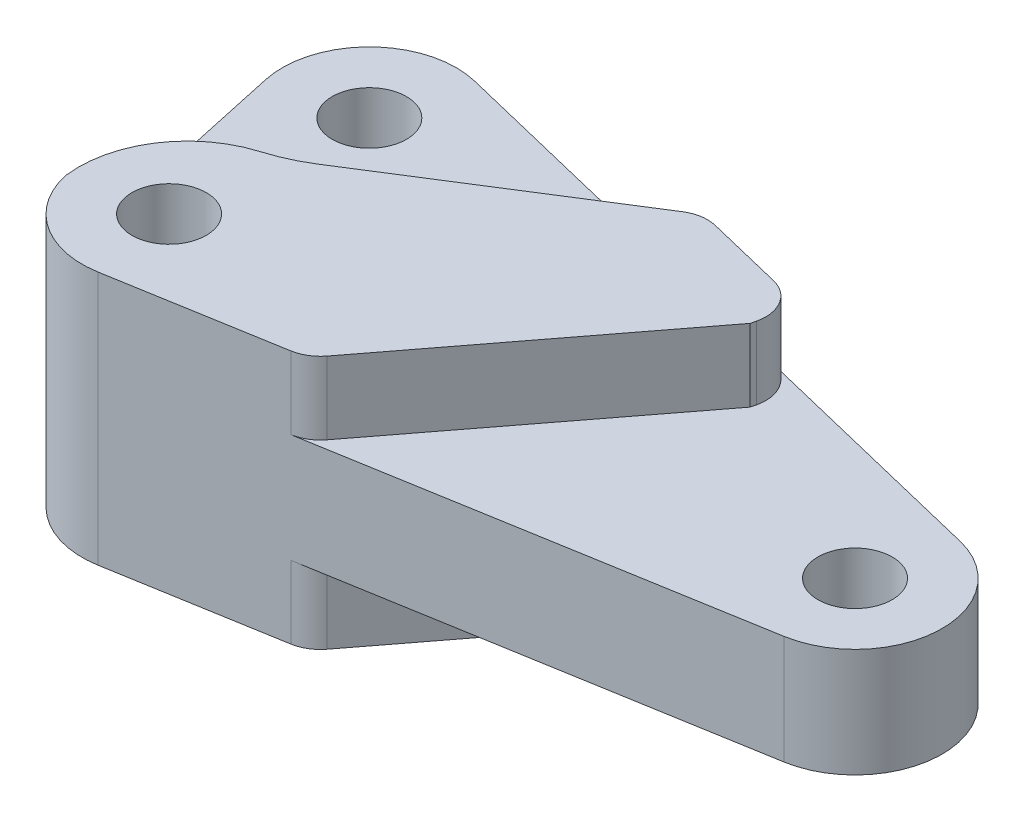
ISO-10303-21;
HEADER;
FILE_DESCRIPTION(('STEP AP214'),'2;1');
FILE_NAME('part.step','',(''),(''),'','','');
FILE_SCHEMA(('AUTOMOTIVE_DESIGN { 1 0 10303 214 1 1 1 1 }'));
ENDSEC;
DATA;
#1=APPLICATION_CONTEXT('core data for automotive mechanical design processes');
#2=APPLICATION_PROTOCOL_DEFINITION('international standard','automotive_design',2000,#1);
#3=PRODUCT_CONTEXT('',#1,'mechanical');
#4=PRODUCT('Part','Part','',(#3));
#5=PRODUCT_RELATED_PRODUCT_CATEGORY('part','',(#4));
#6=PRODUCT_DEFINITION_FORMATION('','',#4);
#7=PRODUCT_DEFINITION_CONTEXT('part definition',#1,'design');
#8=PRODUCT_DEFINITION('design','',#6,#7);
#9=PRODUCT_DEFINITION_SHAPE('','',#8);
#10=(LENGTH_UNIT() NAMED_UNIT(*) SI_UNIT(.MILLI.,.METRE.));
#11=(NAMED_UNIT(*) PLANE_ANGLE_UNIT() SI_UNIT($,.RADIAN.));
#12=(NAMED_UNIT(*) SI_UNIT($,.STERADIAN.) SOLID_ANGLE_UNIT());
#13=UNCERTAINTY_MEASURE_WITH_UNIT(LENGTH_MEASURE(1.E-05),#10,'distance_accuracy_value','');
#14=(GEOMETRIC_REPRESENTATION_CONTEXT(3) GLOBAL_UNCERTAINTY_ASSIGNED_CONTEXT((#13)) GLOBAL_UNIT_ASSIGNED_CONTEXT((#10,
#11,#12)) REPRESENTATION_CONTEXT('',''));
#15=CARTESIAN_POINT('',(0.,0.,0.));
#16=DIRECTION('',(0.,0.,1.));
#17=DIRECTION('',(1.,0.,0.));
#18=AXIS2_PLACEMENT_3D('',#15,#16,#17);
#19=CARTESIAN_POINT('',(2.05330457586919,8.89,12.0311396352858));
#20=DIRECTION('',(0.168233374939517,0.,0.985747194546584));
#21=DIRECTION('',(0.985747194546584,0.,-0.168233374939517));
#22=AXIS2_PLACEMENT_3D('',#19,#20,#21);
#23=PLANE('',#22);
#24=DIRECTION('',(-0.985747194546584,0.,0.168233374939517));
#25=VECTOR('',#24,1.);
#26=CARTESIAN_POINT('',(2.05330457586919,0.,12.0311396352858));
#27=LINE('',#26,#25);
#28=CARTESIAN_POINT('',(8.22636136478721,0.,10.9776097007972));
#29=VERTEX_POINT('',#28);
#30=CARTESIAN_POINT('',(2.45925132581501,0.,11.9618583914061));
#31=VERTEX_POINT('',#30);
#32=EDGE_CURVE('E449',#29,#31,#27,.T.);
#33=ORIENTED_EDGE('',*,*,#32,.F.);
#34=DIRECTION('',(0.,-1.,0.));
#35=VECTOR('',#34,1.);
#36=CARTESIAN_POINT('',(8.22636136478721,8.89,10.9776097007972));
#37=LINE('',#36,#35);
#38=CARTESIAN_POINT('',(8.22636136478721,2.54,10.9776097007972));
#39=VERTEX_POINT('',#38);
#40=EDGE_CURVE('E527',#29,#39,#37,.F.);
#41=ORIENTED_EDGE('',*,*,#40,.T.);
#42=DIRECTION('',(-0.985747194546584,0.,0.168233374939517));
#43=VECTOR('',#42,1.);
#44=CARTESIAN_POINT('',(2.05330457586919,2.54,12.0311396352858));
#45=LINE('',#44,#43);
#46=CARTESIAN_POINT('',(22.9735583569255,2.54,8.46076690924709));
#47=VERTEX_POINT('',#46);
#48=EDGE_CURVE('E303',#47,#39,#45,.T.);
#49=ORIENTED_EDGE('',*,*,#48,.F.);
#50=DIRECTION('',(0.,-1.,0.));
#51=VECTOR('',#50,1.);
#52=CARTESIAN_POINT('',(22.9735583569255,6.35,8.46076690924709));
#53=LINE('',#52,#51);
#54=CARTESIAN_POINT('',(22.9735583569255,6.35,8.46076690924709));
#55=VERTEX_POINT('',#54);
#56=EDGE_CURVE('E409',#55,#47,#53,.T.);
#57=ORIENTED_EDGE('',*,*,#56,.F.);
#58=DIRECTION('',(-0.985747194546584,0.,0.168233374939517));
#59=VECTOR('',#58,1.);
#60=CARTESIAN_POINT('',(2.05330457586919,6.35,12.0311396352858));
#61=LINE('',#60,#59);
#62=CARTESIAN_POINT('',(8.22636136478721,6.35,10.9776097007972));
#63=VERTEX_POINT('',#62);
#64=EDGE_CURVE('E385',#55,#63,#61,.T.);
#65=ORIENTED_EDGE('',*,*,#64,.T.);
#66=DIRECTION('',(0.,-1.,0.));
#67=VECTOR('',#66,1.);
#68=CARTESIAN_POINT('',(8.22636136478721,8.89,10.9776097007972));
#69=LINE('',#68,#67);
#70=CARTESIAN_POINT('',(8.22636136478721,8.89,10.9776097007972));
#71=VERTEX_POINT('',#70);
#72=EDGE_CURVE('E524',#63,#71,#69,.F.);
#73=ORIENTED_EDGE('',*,*,#72,.T.);
#74=DIRECTION('',(-0.985747194546584,0.,0.168233374939517));
#75=VECTOR('',#74,1.);
#76=CARTESIAN_POINT('',(2.05330457586919,8.89,12.0311396352858));
#77=LINE('',#76,#75);
#78=CARTESIAN_POINT('',(2.45925132581501,8.89,11.9618583914061));
#79=VERTEX_POINT('',#78);
#80=EDGE_CURVE('E422',#71,#79,#77,.T.);
#81=ORIENTED_EDGE('',*,*,#80,.T.);
#82=DIRECTION('',(0.,-1.,0.));
#83=VECTOR('',#82,1.);
#84=CARTESIAN_POINT('',(2.45925132581501,8.89,11.9618583914061));
#85=LINE('',#84,#83);
#86=EDGE_CURVE('E463',#79,#31,#85,.T.);
#87=ORIENTED_EDGE('',*,*,#86,.T.);
#88=EDGE_LOOP('',(#33,#41,#49,#57,#65,#73,#81,#87));
#89=FACE_BOUND('',#88,.T.);
#90=ADVANCED_FACE('F113',(#89),#23,.T.);
#91=CARTESIAN_POINT('',(0.719500148606915,8.89,-2.96186149847602));
#92=DIRECTION('',(0.236056479201744,0.,-0.971739336770348));
#93=DIRECTION('',(-0.971739336770349,0.,-0.236056479201744));
#94=AXIS2_PLACEMENT_3D('',#91,#92,#93);
#95=PLANE('',#94);
#96=DIRECTION('',(0.971739336770349,0.,0.236056479201744));
#97=VECTOR('',#96,1.);
#98=CARTESIAN_POINT('',(0.719500148606915,0.,-2.96186149847602));
#99=LINE('',#98,#97);
#100=CARTESIAN_POINT('',(11.8425674851343,0.,-0.259828130030529));
#101=VERTEX_POINT('',#100);
#102=CARTESIAN_POINT('',(14.5415204748284,0.,0.395805861689579));
#103=VERTEX_POINT('',#102);
#104=EDGE_CURVE('E452',#101,#103,#99,.T.);
#105=ORIENTED_EDGE('',*,*,#104,.F.);
#106=DIRECTION('',(0.,-1.,0.));
#107=VECTOR('',#106,1.);
#108=CARTESIAN_POINT('',(11.8425674851343,8.89,-0.259828130030531));
#109=LINE('',#108,#107);
#110=CARTESIAN_POINT('',(11.8425674851343,2.54,-0.259828130030529));
#111=VERTEX_POINT('',#110);
#112=EDGE_CURVE('E504',#101,#111,#109,.F.);
#113=ORIENTED_EDGE('',*,*,#112,.T.);
#114=DIRECTION('',(0.971739336770349,0.,0.236056479201744));
#115=VECTOR('',#114,1.);
#116=CARTESIAN_POINT('',(0.719500148606915,2.54,-2.96186149847602));
#117=LINE('',#116,#115);
#118=CARTESIAN_POINT('',(0.719500148606915,2.54,-2.96186149847602));
#119=VERTEX_POINT('',#118);
#120=EDGE_CURVE('E331',#119,#111,#117,.T.);
#121=ORIENTED_EDGE('',*,*,#120,.F.);
#122=DIRECTION('',(0.,-1.,0.));
#123=VECTOR('',#122,1.);
#124=CARTESIAN_POINT('',(0.719500148606915,6.35,-2.96186149847602));
#125=LINE('',#124,#123);
#126=CARTESIAN_POINT('',(0.719500148606915,6.35,-2.96186149847602));
#127=VERTEX_POINT('',#126);
#128=EDGE_CURVE('E377',#127,#119,#125,.T.);
#129=ORIENTED_EDGE('',*,*,#128,.F.);
#130=DIRECTION('',(0.971739336770349,0.,0.236056479201744));
#131=VECTOR('',#130,1.);
#132=CARTESIAN_POINT('',(0.719500148606915,6.35,-2.96186149847602));
#133=LINE('',#132,#131);
#134=CARTESIAN_POINT('',(11.8425674851343,6.35,-0.25982813003053));
#135=VERTEX_POINT('',#134);
#136=EDGE_CURVE('E363',#127,#135,#133,.T.);
#137=ORIENTED_EDGE('',*,*,#136,.T.);
#138=DIRECTION('',(0.,-1.,0.));
#139=VECTOR('',#138,1.);
#140=CARTESIAN_POINT('',(11.8425674851343,8.89,-0.259828130030531));
#141=LINE('',#140,#139);
#142=CARTESIAN_POINT('',(11.8425674851343,8.89,-0.259828130030529));
#143=VERTEX_POINT('',#142);
#144=EDGE_CURVE('E501',#135,#143,#141,.F.);
#145=ORIENTED_EDGE('',*,*,#144,.T.);
#146=DIRECTION('',(0.971739336770349,0.,0.236056479201744));
#147=VECTOR('',#146,1.);
#148=CARTESIAN_POINT('',(0.719500148606915,8.89,-2.96186149847602));
#149=LINE('',#148,#147);
#150=CARTESIAN_POINT('',(14.5415204748284,8.89,0.395805861689579));
#151=VERTEX_POINT('',#150);
#152=EDGE_CURVE('E433',#143,#151,#149,.T.);
#153=ORIENTED_EDGE('',*,*,#152,.T.);
#154=DIRECTION('',(0.,-1.,0.));
#155=VECTOR('',#154,1.);
#156=CARTESIAN_POINT('',(14.5415204748284,6.35,0.395805861689578));
#157=LINE('',#156,#155);
#158=CARTESIAN_POINT('',(14.5415204748284,6.35,0.395805861689579));
#159=VERTEX_POINT('',#158);
#160=EDGE_CURVE('E497',#151,#159,#157,.T.);
#161=ORIENTED_EDGE('',*,*,#160,.T.);
#162=DIRECTION('',(0.971739336770349,0.,0.236056479201744));
#163=VECTOR('',#162,1.);
#164=CARTESIAN_POINT('',(0.719500148606915,6.35,-2.96186149847602));
#165=LINE('',#164,#163);
#166=CARTESIAN_POINT('',(23.1802831787168,6.35,2.49434796179308));
#167=VERTEX_POINT('',#166);
#168=EDGE_CURVE('E392',#159,#167,#165,.T.);
#169=ORIENTED_EDGE('',*,*,#168,.T.);
#170=DIRECTION('',(0.,-1.,0.));
#171=VECTOR('',#170,1.);
#172=CARTESIAN_POINT('',(23.1802831787168,6.35,2.49434796179308));
#173=LINE('',#172,#171);
#174=CARTESIAN_POINT('',(23.1802831787168,2.54,2.49434796179308));
#175=VERTEX_POINT('',#174);
#176=EDGE_CURVE('E405',#167,#175,#173,.T.);
#177=ORIENTED_EDGE('',*,*,#176,.T.);
#178=DIRECTION('',(0.971739336770349,0.,0.236056479201744));
#179=VECTOR('',#178,1.);
#180=CARTESIAN_POINT('',(0.719500148606915,2.54,-2.96186149847602));
#181=LINE('',#180,#179);
#182=CARTESIAN_POINT('',(14.5415204748284,2.54,0.395805861689579));
#183=VERTEX_POINT('',#182);
#184=EDGE_CURVE('E294',#183,#175,#181,.T.);
#185=ORIENTED_EDGE('',*,*,#184,.F.);
#186=DIRECTION('',(0.,-1.,0.));
#187=VECTOR('',#186,1.);
#188=CARTESIAN_POINT('',(14.5415204748284,0.,0.395805861689578));
#189=LINE('',#188,#187);
#190=EDGE_CURVE('E493',#183,#103,#189,.T.);
#191=ORIENTED_EDGE('',*,*,#190,.T.);
#192=EDGE_LOOP('',(#105,#113,#121,#129,#137,#145,#153,#161,#169,#177,#185,#191));
#193=FACE_BOUND('',#192,.T.);
#194=ADVANCED_FACE('F636',(#193),#95,.T.);
#195=CARTESIAN_POINT('',(0.,0.,0.));
#196=DIRECTION('',(0.,1.,0.));
#197=DIRECTION('',(0.,0.,1.));
#198=AXIS2_PLACEMENT_3D('',#195,#196,#197);
#199=PLANE('',#198);
#200=CARTESIAN_POINT('',(1.94647599899937,0.,8.95730094242811));
#201=DIRECTION('',(0.,1.,0.));
#202=DIRECTION('',(0.,0.,1.));
#203=AXIS2_PLACEMENT_3D('',#200,#201,#202);
#204=CIRCLE('',#203,1.2999974);
#205=CARTESIAN_POINT('',(1.94647599899937,0.,10.2572983424281));
#206=VERTEX_POINT('',#205);
#207=EDGE_CURVE('E418',#206,#206,#204,.T.);
#208=ORIENTED_EDGE('',*,*,#207,.T.);
#209=EDGE_LOOP('',(#208));
#210=FACE_BOUND('',#209,.T.);
#211=DIRECTION('',(0.845633638943895,0.,-0.533763757374465));
#212=VECTOR('',#211,1.);
#213=CARTESIAN_POINT('',(3.05045987339507,0.,4.83279624656436));
#214=LINE('',#213,#212);
#215=CARTESIAN_POINT('',(3.05045987339507,0.,4.83279624656436));
#216=VERTEX_POINT('',#215);
#217=CARTESIAN_POINT('',(10.8648957846825,0.,-0.0996738937909351));
#218=VERTEX_POINT('',#217);
#219=EDGE_CURVE('E327',#216,#218,#214,.T.);
#220=ORIENTED_EDGE('',*,*,#219,.T.);
#221=CARTESIAN_POINT('',(11.5427757565481,0.,0.974280827667812));
#222=DIRECTION('',(0.,1.,0.));
#223=DIRECTION('',(0.,0.,1.));
#224=AXIS2_PLACEMENT_3D('',#221,#222,#223);
#225=CIRCLE('',#224,1.27);
#226=EDGE_CURVE('E490',#218,#101,#225,.F.);
#227=ORIENTED_EDGE('',*,*,#226,.T.);
#228=ORIENTED_EDGE('',*,*,#104,.T.);
#229=CARTESIAN_POINT('',(14.2417287462421,0.,1.62991481938792));
#230=DIRECTION('',(0.,1.,0.));
#231=DIRECTION('',(0.,0.,1.));
#232=AXIS2_PLACEMENT_3D('',#229,#230,#231);
#233=CIRCLE('',#232,1.27);
#234=CARTESIAN_POINT('',(15.4758377039405,0.,1.92970654797413));
#235=VERTEX_POINT('',#234);
#236=EDGE_CURVE('E484',#103,#235,#233,.F.);
#237=ORIENTED_EDGE('',*,*,#236,.T.);
#238=DIRECTION('',(0.236056479201743,0.,-0.971739336770349));
#239=VECTOR('',#238,1.);
#240=CARTESIAN_POINT('',(15.0561292839198,0.,3.65745908875181));
#241=LINE('',#240,#239);
#242=CARTESIAN_POINT('',(15.4338828000476,0.,2.10241619195867));
#243=VERTEX_POINT('',#242);
#244=EDGE_CURVE('E309',#243,#235,#241,.T.);
#245=ORIENTED_EDGE('',*,*,#244,.F.);
#246=DIRECTION('',(-0.607021351259015,0.,0.794685522150542));
#247=VECTOR('',#246,1.);
#248=CARTESIAN_POINT('',(10.7610708727211,0.,8.21985502450838));
#249=LINE('',#248,#247);
#250=CARTESIAN_POINT('',(9.02195559174521,0.,10.496627879822));
#251=VERTEX_POINT('',#250);
#252=EDGE_CURVE('E290',#243,#251,#249,.T.);
#253=ORIENTED_EDGE('',*,*,#252,.T.);
#254=CARTESIAN_POINT('',(8.01270497861402,0.,9.72571076372304));
#255=DIRECTION('',(0.,1.,0.));
#256=DIRECTION('',(0.,0.,1.));
#257=AXIS2_PLACEMENT_3D('',#254,#255,#256);
#258=CIRCLE('',#257,1.27);
#259=EDGE_CURVE('E487',#251,#29,#258,.F.);
#260=ORIENTED_EDGE('',*,*,#259,.T.);
#261=ORIENTED_EDGE('',*,*,#32,.T.);
#262=CARTESIAN_POINT('',(1.94647599899937,0.,8.95730094242811));
#263=DIRECTION('',(0.,1.,0.));
#264=DIRECTION('',(0.,0.,1.));
#265=AXIS2_PLACEMENT_3D('',#262,#263,#264);
#266=CIRCLE('',#265,3.048);
#267=CARTESIAN_POINT('',(-1.03201023767591,0.,9.60454412542501));
#268=VERTEX_POINT('',#267);
#269=EDGE_CURVE('E413',#268,#31,#266,.T.);
#270=ORIENTED_EDGE('',*,*,#269,.F.);
#271=CARTESIAN_POINT('',(2.74708607229645,0.,9.12026003529476));
#272=DIRECTION('',(0.,1.,0.));
#273=DIRECTION('',(0.,0.,1.));
#274=AXIS2_PLACEMENT_3D('',#271,#272,#273);
#275=CIRCLE('',#274,3.81);
#276=CARTESIAN_POINT('',(1.64825164337787,0.,5.47215602117686));
#277=VERTEX_POINT('',#276);
#278=EDGE_CURVE('E472',#268,#277,#275,.F.);
#279=ORIENTED_EDGE('',*,*,#278,.T.);
#280=CARTESIAN_POINT('',(0.,0.,0.));
#281=DIRECTION('',(0.,1.,0.));
#282=DIRECTION('',(0.,0.,1.));
#283=AXIS2_PLACEMENT_3D('',#280,#281,#282);
#284=CIRCLE('',#283,5.715);
#285=EDGE_CURVE('E293',#277,#216,#284,.T.);
#286=ORIENTED_EDGE('',*,*,#285,.T.);
#287=EDGE_LOOP('',(#220,#227,#228,#237,#245,#253,#260,#261,#270,#279,#286));
#288=FACE_BOUND('',#287,.T.);
#289=ADVANCED_FACE('F658',(#210,#288),#199,.F.);
#290=CARTESIAN_POINT('',(0.,8.89,0.));
#291=DIRECTION('',(0.,-1.,0.));
#292=DIRECTION('',(0.,0.,-1.));
#293=AXIS2_PLACEMENT_3D('',#290,#291,#292);
#294=CYLINDRICAL_SURFACE('',#293,5.715);
#295=CARTESIAN_POINT('',(0.,6.35,0.));
#296=DIRECTION('',(0.,1.,0.));
#297=DIRECTION('',(0.,0.,1.));
#298=AXIS2_PLACEMENT_3D('',#295,#296,#297);
#299=CIRCLE('',#298,5.715);
#300=CARTESIAN_POINT('',(1.64825164337787,6.35,5.47215602117686));
#301=VERTEX_POINT('',#300);
#302=CARTESIAN_POINT('',(3.05045987339507,6.35,4.83279624656436));
#303=VERTEX_POINT('',#302);
#304=EDGE_CURVE('E355',#301,#303,#299,.T.);
#305=ORIENTED_EDGE('',*,*,#304,.F.);
#306=DIRECTION('',(0.,-1.,0.));
#307=VECTOR('',#306,1.);
#308=CARTESIAN_POINT('',(1.64825164337787,8.89,5.47215602117686));
#309=LINE('',#308,#307);
#310=CARTESIAN_POINT('',(1.64825164337787,8.89,5.47215602117686));
#311=VERTEX_POINT('',#310);
#312=EDGE_CURVE('E564',#301,#311,#309,.F.);
#313=ORIENTED_EDGE('',*,*,#312,.T.);
#314=CARTESIAN_POINT('',(0.,8.89,0.));
#315=DIRECTION('',(0.,1.,0.));
#316=DIRECTION('',(0.,0.,1.));
#317=AXIS2_PLACEMENT_3D('',#314,#315,#316);
#318=CIRCLE('',#317,5.715);
#319=CARTESIAN_POINT('',(3.05045987339507,8.89,4.83279624656436));
#320=VERTEX_POINT('',#319);
#321=EDGE_CURVE('E414',#311,#320,#318,.T.);
#322=ORIENTED_EDGE('',*,*,#321,.T.);
#323=DIRECTION('',(0.,-1.,0.));
#324=VECTOR('',#323,1.);
#325=CARTESIAN_POINT('',(3.05045987339507,8.89,4.83279624656436));
#326=LINE('',#325,#324);
#327=EDGE_CURVE('E445',#320,#303,#326,.T.);
#328=ORIENTED_EDGE('',*,*,#327,.T.);
#329=EDGE_LOOP('',(#305,#313,#322,#328));
#330=FACE_BOUND('',#329,.T.);
#331=ADVANCED_FACE('F625',(#330),#294,.F.);
#332=CARTESIAN_POINT('',(-2.97848623667528,8.89,0.647243182996907));
#333=DIRECTION('',(0.977193647203174,0.,-0.212350125655153));
#334=DIRECTION('',(-0.212350125655153,0.,-0.977193647203174));
#335=AXIS2_PLACEMENT_3D('',#332,#333,#334);
#336=PLANE('',#335);
#337=DIRECTION('',(0.212350125655153,0.,0.977193647203174));
#338=VECTOR('',#337,1.);
#339=CARTESIAN_POINT('',(-2.97848623667528,2.54,0.647243182996907));
#340=LINE('',#339,#338);
#341=CARTESIAN_POINT('',(-2.97848623667528,2.54,0.647243182996907));
#342=VERTEX_POINT('',#341);
#343=CARTESIAN_POINT('',(-1.03201023767591,2.54,9.60454412542501));
#344=VERTEX_POINT('',#343);
#345=EDGE_CURVE('E338',#342,#344,#340,.T.);
#346=ORIENTED_EDGE('',*,*,#345,.T.);
#347=DIRECTION('',(0.,-1.,0.));
#348=VECTOR('',#347,1.);
#349=CARTESIAN_POINT('',(-1.03201023767591,8.89,9.60454412542501));
#350=LINE('',#349,#348);
#351=CARTESIAN_POINT('',(-1.03201023767591,6.35,9.60454412542501));
#352=VERTEX_POINT('',#351);
#353=EDGE_CURVE('E473',#352,#344,#350,.T.);
#354=ORIENTED_EDGE('',*,*,#353,.F.);
#355=DIRECTION('',(0.212350125655153,0.,0.977193647203174));
#356=VECTOR('',#355,1.);
#357=CARTESIAN_POINT('',(-2.97848623667528,6.35,0.647243182996907));
#358=LINE('',#357,#356);
#359=CARTESIAN_POINT('',(-2.97848623667528,6.35,0.647243182996907));
#360=VERTEX_POINT('',#359);
#361=EDGE_CURVE('E370',#360,#352,#358,.T.);
#362=ORIENTED_EDGE('',*,*,#361,.F.);
#363=DIRECTION('',(0.,-1.,0.));
#364=VECTOR('',#363,1.);
#365=CARTESIAN_POINT('',(-2.97848623667528,6.35,0.647243182996907));
#366=LINE('',#365,#364);
#367=EDGE_CURVE('E373',#360,#342,#366,.T.);
#368=ORIENTED_EDGE('',*,*,#367,.T.);
#369=EDGE_LOOP('',(#346,#354,#362,#368));
#370=FACE_BOUND('',#369,.T.);
#371=ADVANCED_FACE('F609',(#370),#336,.F.);
#372=CARTESIAN_POINT('',(1.94647599899937,8.89,8.95730094242811));
#373=DIRECTION('',(0.,-1.,0.));
#374=DIRECTION('',(0.,0.,-1.));
#375=AXIS2_PLACEMENT_3D('',#372,#373,#374);
#376=CYLINDRICAL_SURFACE('',#375,3.048);
#377=ORIENTED_EDGE('',*,*,#269,.T.);
#378=ORIENTED_EDGE('',*,*,#86,.F.);
#379=CARTESIAN_POINT('',(1.94647599899937,8.89,8.95730094242811));
#380=DIRECTION('',(0.,1.,0.));
#381=DIRECTION('',(0.,0.,1.));
#382=AXIS2_PLACEMENT_3D('',#379,#380,#381);
#383=CIRCLE('',#382,3.048);
#384=CARTESIAN_POINT('',(-1.03201023767591,8.89,9.60454412542501));
#385=VERTEX_POINT('',#384);
#386=EDGE_CURVE('E417',#385,#79,#383,.T.);
#387=ORIENTED_EDGE('',*,*,#386,.F.);
#388=EDGE_CURVE('E468',#385,#352,#350,.T.);
#389=ORIENTED_EDGE('',*,*,#388,.T.);
#390=ORIENTED_EDGE('',*,*,#353,.T.);
#391=EDGE_CURVE('E467',#344,#268,#350,.T.);
#392=ORIENTED_EDGE('',*,*,#391,.T.);
#393=EDGE_LOOP('',(#377,#378,#387,#389,#390,#392));
#394=FACE_BOUND('',#393,.T.);
#395=ADVANCED_FACE('F613',(#394),#376,.T.);
#396=CARTESIAN_POINT('',(10.7610708727211,8.89,8.21985502450838));
#397=DIRECTION('',(0.794685522150542,0.,0.607021351259015));
#398=DIRECTION('',(0.607021351259015,0.,-0.794685522150542));
#399=AXIS2_PLACEMENT_3D('',#396,#397,#398);
#400=PLANE('',#399);
#401=DIRECTION('',(-0.607021351259015,0.,0.794685522150542));
#402=VECTOR('',#401,1.);
#403=CARTESIAN_POINT('',(10.7610708727211,8.89,8.21985502450838));
#404=LINE('',#403,#402);
#405=CARTESIAN_POINT('',(15.4338828000476,8.89,2.10241619195867));
#406=VERTEX_POINT('',#405);
#407=CARTESIAN_POINT('',(9.02195559174521,8.89,10.496627879822));
#408=VERTEX_POINT('',#407);
#409=EDGE_CURVE('E425',#406,#408,#404,.T.);
#410=ORIENTED_EDGE('',*,*,#409,.T.);
#411=DIRECTION('',(0.,-1.,0.));
#412=VECTOR('',#411,1.);
#413=CARTESIAN_POINT('',(9.02195559174521,8.89,10.496627879822));
#414=LINE('',#413,#412);
#415=CARTESIAN_POINT('',(9.02195559174521,6.35,10.496627879822));
#416=VERTEX_POINT('',#415);
#417=EDGE_CURVE('E531',#408,#416,#414,.T.);
#418=ORIENTED_EDGE('',*,*,#417,.T.);
#419=DIRECTION('',(-0.607021351259015,0.,0.794685522150542));
#420=VECTOR('',#419,1.);
#421=CARTESIAN_POINT('',(10.7610708727211,6.35,8.21985502450838));
#422=LINE('',#421,#420);
#423=CARTESIAN_POINT('',(15.4338828000476,6.35,2.10241619195867));
#424=VERTEX_POINT('',#423);
#425=EDGE_CURVE('E381',#424,#416,#422,.T.);
#426=ORIENTED_EDGE('',*,*,#425,.F.);
#427=DIRECTION('',(0.,-1.,0.));
#428=VECTOR('',#427,1.);
#429=CARTESIAN_POINT('',(15.4338828000476,8.89,2.10241619195867));
#430=LINE('',#429,#428);
#431=EDGE_CURVE('E459',#406,#424,#430,.T.);
#432=ORIENTED_EDGE('',*,*,#431,.F.);
#433=EDGE_LOOP('',(#410,#418,#426,#432));
#434=FACE_BOUND('',#433,.T.);
#435=ADVANCED_FACE('F692',(#434),#400,.T.);
#436=CARTESIAN_POINT('',(15.0561292839198,8.89,3.65745908875181));
#437=DIRECTION('',(-0.971739336770349,0.,-0.236056479201743));
#438=DIRECTION('',(-0.236056479201743,0.,0.971739336770349));
#439=AXIS2_PLACEMENT_3D('',#436,#437,#438);
#440=PLANE('',#439);
#441=DIRECTION('',(0.236056479201743,0.,-0.971739336770349));
#442=VECTOR('',#441,1.);
#443=CARTESIAN_POINT('',(15.0561292839198,6.35,3.65745908875181));
#444=LINE('',#443,#442);
#445=CARTESIAN_POINT('',(15.4758377039405,6.35,1.92970654797413));
#446=VERTEX_POINT('',#445);
#447=EDGE_CURVE('E396',#424,#446,#444,.T.);
#448=ORIENTED_EDGE('',*,*,#447,.T.);
#449=DIRECTION('',(0.,-1.,0.));
#450=VECTOR('',#449,1.);
#451=CARTESIAN_POINT('',(15.4758377039405,8.89,1.92970654797413));
#452=LINE('',#451,#450);
#453=CARTESIAN_POINT('',(15.4758377039405,8.89,1.92970654797413));
#454=VERTEX_POINT('',#453);
#455=EDGE_CURVE('E535',#446,#454,#452,.F.);
#456=ORIENTED_EDGE('',*,*,#455,.T.);
#457=DIRECTION('',(0.236056479201743,0.,-0.971739336770349));
#458=VECTOR('',#457,1.);
#459=CARTESIAN_POINT('',(15.0561292839198,8.89,3.65745908875181));
#460=LINE('',#459,#458);
#461=EDGE_CURVE('E429',#406,#454,#460,.T.);
#462=ORIENTED_EDGE('',*,*,#461,.F.);
#463=ORIENTED_EDGE('',*,*,#431,.T.);
#464=EDGE_LOOP('',(#448,#456,#462,#463));
#465=FACE_BOUND('',#464,.T.);
#466=ADVANCED_FACE('F832',(#465),#440,.F.);
#467=CARTESIAN_POINT('',(3.05045987339507,8.89,4.83279624656436));
#468=DIRECTION('',(-0.533763757374465,0.,-0.845633638943895));
#469=DIRECTION('',(-0.845633638943895,0.,0.533763757374465));
#470=AXIS2_PLACEMENT_3D('',#467,#468,#469);
#471=PLANE('',#470);
#472=DIRECTION('',(0.845633638943895,0.,-0.533763757374465));
#473=VECTOR('',#472,1.);
#474=CARTESIAN_POINT('',(3.05045987339507,8.89,4.83279624656436));
#475=LINE('',#474,#473);
#476=CARTESIAN_POINT('',(10.8648957846825,8.89,-0.0996738937909351));
#477=VERTEX_POINT('',#476);
#478=EDGE_CURVE('E437',#320,#477,#475,.T.);
#479=ORIENTED_EDGE('',*,*,#478,.T.);
#480=DIRECTION('',(0.,-1.,0.));
#481=VECTOR('',#480,1.);
#482=CARTESIAN_POINT('',(10.8648957846825,8.89,-0.0996738937909351));
#483=LINE('',#482,#481);
#484=CARTESIAN_POINT('',(10.8648957846825,6.35,-0.0996738937909351));
#485=VERTEX_POINT('',#484);
#486=EDGE_CURVE('E508',#477,#485,#483,.T.);
#487=ORIENTED_EDGE('',*,*,#486,.T.);
#488=DIRECTION('',(0.845633638943895,0.,-0.533763757374465));
#489=VECTOR('',#488,1.);
#490=CARTESIAN_POINT('',(3.05045987339507,6.35,4.83279624656436));
#491=LINE('',#490,#489);
#492=EDGE_CURVE('E359',#303,#485,#491,.T.);
#493=ORIENTED_EDGE('',*,*,#492,.F.);
#494=ORIENTED_EDGE('',*,*,#327,.F.);
#495=EDGE_LOOP('',(#479,#487,#493,#494));
#496=FACE_BOUND('',#495,.T.);
#497=ADVANCED_FACE('F628',(#496),#471,.T.);
#498=CARTESIAN_POINT('',(1.94647599899937,8.89,8.95730094242811));
#499=DIRECTION('',(0.,-1.,0.));
#500=DIRECTION('',(0.,0.,-1.));
#501=AXIS2_PLACEMENT_3D('',#498,#499,#500);
#502=CYLINDRICAL_SURFACE('',#501,1.2999974);
#503=CARTESIAN_POINT('',(1.94647599899937,8.89,8.95730094242811));
#504=DIRECTION('',(0.,1.,0.));
#505=DIRECTION('',(0.,0.,1.));
#506=AXIS2_PLACEMENT_3D('',#503,#504,#505);
#507=CIRCLE('',#506,1.2999974);
#508=CARTESIAN_POINT('',(1.94647599899937,8.89,10.2572983424281));
#509=VERTEX_POINT('',#508);
#510=EDGE_CURVE('E441',#509,#509,#507,.T.);
#511=ORIENTED_EDGE('',*,*,#510,.T.);
#512=EDGE_LOOP('',(#511));
#513=FACE_BOUND('',#512,.T.);
#514=ORIENTED_EDGE('',*,*,#207,.F.);
#515=EDGE_LOOP('',(#514));
#516=FACE_BOUND('',#515,.T.);
#517=ADVANCED_FACE('F823',(#513,#516),#502,.F.);
#518=CARTESIAN_POINT('',(0.,8.89,0.));
#519=DIRECTION('',(0.,1.,0.));
#520=DIRECTION('',(0.,0.,1.));
#521=AXIS2_PLACEMENT_3D('',#518,#519,#520);
#522=PLANE('',#521);
#523=ORIENTED_EDGE('',*,*,#152,.F.);
#524=CARTESIAN_POINT('',(11.5427757565481,8.89,0.974280827667811));
#525=DIRECTION('',(0.,1.,0.));
#526=DIRECTION('',(0.,0.,1.));
#527=AXIS2_PLACEMENT_3D('',#524,#525,#526);
#528=CIRCLE('',#527,1.27);
#529=EDGE_CURVE('E518',#143,#477,#528,.T.);
#530=ORIENTED_EDGE('',*,*,#529,.T.);
#531=ORIENTED_EDGE('',*,*,#478,.F.);
#532=ORIENTED_EDGE('',*,*,#321,.F.);
#533=CARTESIAN_POINT('',(2.74708607229645,8.89,9.12026003529476));
#534=DIRECTION('',(0.,1.,0.));
#535=DIRECTION('',(0.,0.,1.));
#536=AXIS2_PLACEMENT_3D('',#533,#534,#535);
#537=CIRCLE('',#536,3.81);
#538=EDGE_CURVE('E561',#311,#385,#537,.T.);
#539=ORIENTED_EDGE('',*,*,#538,.T.);
#540=ORIENTED_EDGE('',*,*,#386,.T.);
#541=ORIENTED_EDGE('',*,*,#80,.F.);
#542=CARTESIAN_POINT('',(8.01270497861402,8.89,9.72571076372304));
#543=DIRECTION('',(0.,1.,0.));
#544=DIRECTION('',(0.,0.,1.));
#545=AXIS2_PLACEMENT_3D('',#542,#543,#544);
#546=CIRCLE('',#545,1.27);
#547=EDGE_CURVE('E515',#71,#408,#546,.T.);
#548=ORIENTED_EDGE('',*,*,#547,.T.);
#549=ORIENTED_EDGE('',*,*,#409,.F.);
#550=ORIENTED_EDGE('',*,*,#461,.T.);
#551=CARTESIAN_POINT('',(14.2417287462421,8.89,1.62991481938792));
#552=DIRECTION('',(0.,1.,0.));
#553=DIRECTION('',(0.,0.,1.));
#554=AXIS2_PLACEMENT_3D('',#551,#552,#553);
#555=CIRCLE('',#554,1.27);
#556=EDGE_CURVE('E512',#454,#151,#555,.T.);
#557=ORIENTED_EDGE('',*,*,#556,.T.);
#558=EDGE_LOOP('',(#523,#530,#531,#532,#539,#540,#541,#548,#549,#550,#557));
#559=FACE_BOUND('',#558,.T.);
#560=ORIENTED_EDGE('',*,*,#510,.F.);
#561=EDGE_LOOP('',(#560));
#562=FACE_BOUND('',#561,.T.);
#563=ADVANCED_FACE('F618',(#559,#562),#522,.T.);
#564=CARTESIAN_POINT('',(22.4607830301098,6.35,5.4562094602691));
#565=DIRECTION('',(0.,-1.,0.));
#566=DIRECTION('',(0.,0.,-1.));
#567=AXIS2_PLACEMENT_3D('',#564,#565,#566);
#568=CYLINDRICAL_SURFACE('',#567,3.048);
#569=CARTESIAN_POINT('',(22.4607830301098,2.54,5.4562094602691));
#570=DIRECTION('',(0.,1.,0.));
#571=DIRECTION('',(0.,0.,1.));
#572=AXIS2_PLACEMENT_3D('',#569,#570,#571);
#573=CIRCLE('',#572,3.048);
#574=EDGE_CURVE('E314',#175,#47,#573,.F.);
#575=ORIENTED_EDGE('',*,*,#574,.F.);
#576=ORIENTED_EDGE('',*,*,#176,.F.);
#577=CARTESIAN_POINT('',(22.4607830301098,6.35,5.4562094602691));
#578=DIRECTION('',(0.,1.,0.));
#579=DIRECTION('',(0.,0.,1.));
#580=AXIS2_PLACEMENT_3D('',#577,#578,#579);
#581=CIRCLE('',#580,3.048);
#582=EDGE_CURVE('E388',#167,#55,#581,.F.);
#583=ORIENTED_EDGE('',*,*,#582,.T.);
#584=ORIENTED_EDGE('',*,*,#56,.T.);
#585=EDGE_LOOP('',(#575,#576,#583,#584));
#586=FACE_BOUND('',#585,.T.);
#587=ADVANCED_FACE('F650',(#586),#568,.T.);
#588=CARTESIAN_POINT('',(22.4607830301098,6.35,5.4562094602691));
#589=DIRECTION('',(0.,-1.,0.));
#590=DIRECTION('',(0.,0.,-1.));
#591=AXIS2_PLACEMENT_3D('',#588,#589,#590);
#592=CYLINDRICAL_SURFACE('',#591,1.2999974);
#593=CARTESIAN_POINT('',(22.4607830301098,2.54,5.4562094602691));
#594=DIRECTION('',(0.,1.,0.));
#595=DIRECTION('',(0.,0.,1.));
#596=AXIS2_PLACEMENT_3D('',#593,#594,#595);
#597=CIRCLE('',#596,1.2999974);
#598=CARTESIAN_POINT('',(22.4607830301098,2.54,6.7562068602691));
#599=VERTEX_POINT('',#598);
#600=EDGE_CURVE('E356',#599,#599,#597,.T.);
#601=ORIENTED_EDGE('',*,*,#600,.F.);
#602=EDGE_LOOP('',(#601));
#603=FACE_BOUND('',#602,.T.);
#604=CARTESIAN_POINT('',(22.4607830301098,6.35,5.4562094602691));
#605=DIRECTION('',(0.,1.,0.));
#606=DIRECTION('',(0.,0.,1.));
#607=AXIS2_PLACEMENT_3D('',#604,#605,#606);
#608=CIRCLE('',#607,1.2999974);
#609=CARTESIAN_POINT('',(22.4607830301098,6.35,6.7562068602691));
#610=VERTEX_POINT('',#609);
#611=EDGE_CURVE('E401',#610,#610,#608,.T.);
#612=ORIENTED_EDGE('',*,*,#611,.T.);
#613=EDGE_LOOP('',(#612));
#614=FACE_BOUND('',#613,.T.);
#615=ADVANCED_FACE('F681',(#603,#614),#592,.F.);
#616=CARTESIAN_POINT('',(0.,6.35,0.));
#617=DIRECTION('',(0.,1.,0.));
#618=DIRECTION('',(0.,0.,1.));
#619=AXIS2_PLACEMENT_3D('',#616,#617,#618);
#620=PLANE('',#619);
#621=ORIENTED_EDGE('',*,*,#425,.T.);
#622=CARTESIAN_POINT('',(8.01270497861402,6.35,9.72571076372304));
#623=DIRECTION('',(0.,1.,0.));
#624=DIRECTION('',(0.,0.,1.));
#625=AXIS2_PLACEMENT_3D('',#622,#623,#624);
#626=CIRCLE('',#625,1.27);
#627=EDGE_CURVE('E549',#416,#63,#626,.F.);
#628=ORIENTED_EDGE('',*,*,#627,.T.);
#629=ORIENTED_EDGE('',*,*,#64,.F.);
#630=ORIENTED_EDGE('',*,*,#582,.F.);
#631=ORIENTED_EDGE('',*,*,#168,.F.);
#632=CARTESIAN_POINT('',(14.2417287462421,6.35,1.62991481938792));
#633=DIRECTION('',(0.,1.,0.));
#634=DIRECTION('',(0.,0.,1.));
#635=AXIS2_PLACEMENT_3D('',#632,#633,#634);
#636=CIRCLE('',#635,1.27);
#637=EDGE_CURVE('E122',#159,#446,#636,.F.);
#638=ORIENTED_EDGE('',*,*,#637,.T.);
#639=ORIENTED_EDGE('',*,*,#447,.F.);
#640=EDGE_LOOP('',(#621,#628,#629,#630,#631,#638,#639));
#641=FACE_BOUND('',#640,.T.);
#642=ORIENTED_EDGE('',*,*,#611,.F.);
#643=EDGE_LOOP('',(#642));
#644=FACE_BOUND('',#643,.T.);
#645=ADVANCED_FACE('F645',(#641,#644),#620,.T.);
#646=CARTESIAN_POINT('',(0.,6.35,0.));
#647=DIRECTION('',(0.,-1.,0.));
#648=DIRECTION('',(0.,0.,-1.));
#649=AXIS2_PLACEMENT_3D('',#646,#647,#648);
#650=CYLINDRICAL_SURFACE('',#649,3.048);
#651=ORIENTED_EDGE('',*,*,#128,.T.);
#652=CARTESIAN_POINT('',(0.,2.54,0.));
#653=DIRECTION('',(0.,1.,0.));
#654=DIRECTION('',(0.,0.,1.));
#655=AXIS2_PLACEMENT_3D('',#652,#653,#654);
#656=CIRCLE('',#655,3.048);
#657=EDGE_CURVE('E334',#119,#342,#656,.T.);
#658=ORIENTED_EDGE('',*,*,#657,.T.);
#659=ORIENTED_EDGE('',*,*,#367,.F.);
#660=CARTESIAN_POINT('',(0.,6.35,0.));
#661=DIRECTION('',(0.,1.,0.));
#662=DIRECTION('',(0.,0.,1.));
#663=AXIS2_PLACEMENT_3D('',#660,#661,#662);
#664=CIRCLE('',#663,3.048);
#665=EDGE_CURVE('E366',#127,#360,#664,.T.);
#666=ORIENTED_EDGE('',*,*,#665,.F.);
#667=EDGE_LOOP('',(#651,#658,#659,#666));
#668=FACE_BOUND('',#667,.T.);
#669=ADVANCED_FACE('F589',(#668),#650,.T.);
#670=CARTESIAN_POINT('',(0.,6.35,0.));
#671=DIRECTION('',(0.,-1.,0.));
#672=DIRECTION('',(0.,0.,-1.));
#673=AXIS2_PLACEMENT_3D('',#670,#671,#672);
#674=CYLINDRICAL_SURFACE('',#673,1.2999974);
#675=CARTESIAN_POINT('',(0.,2.54,0.));
#676=DIRECTION('',(0.,1.,0.));
#677=DIRECTION('',(0.,0.,1.));
#678=AXIS2_PLACEMENT_3D('',#675,#676,#677);
#679=CIRCLE('',#678,1.2999974);
#680=CARTESIAN_POINT('',(0.,2.54,1.2999974));
#681=VERTEX_POINT('',#680);
#682=EDGE_CURVE('E350',#681,#681,#679,.T.);
#683=ORIENTED_EDGE('',*,*,#682,.F.);
#684=EDGE_LOOP('',(#683));
#685=FACE_BOUND('',#684,.T.);
#686=CARTESIAN_POINT('',(0.,6.35,0.));
#687=DIRECTION('',(0.,1.,0.));
#688=DIRECTION('',(0.,0.,1.));
#689=AXIS2_PLACEMENT_3D('',#686,#687,#688);
#690=CIRCLE('',#689,1.2999974);
#691=CARTESIAN_POINT('',(0.,6.35,1.2999974));
#692=VERTEX_POINT('',#691);
#693=EDGE_CURVE('E351',#692,#692,#690,.T.);
#694=ORIENTED_EDGE('',*,*,#693,.T.);
#695=EDGE_LOOP('',(#694));
#696=FACE_BOUND('',#695,.T.);
#697=ADVANCED_FACE('F585',(#685,#696),#674,.F.);
#698=CARTESIAN_POINT('',(0.,6.35,0.));
#699=DIRECTION('',(0.,1.,0.));
#700=DIRECTION('',(0.,0.,1.));
#701=AXIS2_PLACEMENT_3D('',#698,#699,#700);
#702=PLANE('',#701);
#703=ORIENTED_EDGE('',*,*,#693,.F.);
#704=EDGE_LOOP('',(#703));
#705=FACE_BOUND('',#704,.T.);
#706=ORIENTED_EDGE('',*,*,#361,.T.);
#707=CARTESIAN_POINT('',(2.74708607229645,6.35,9.12026003529476));
#708=DIRECTION('',(0.,1.,0.));
#709=DIRECTION('',(0.,0.,1.));
#710=AXIS2_PLACEMENT_3D('',#707,#708,#709);
#711=CIRCLE('',#710,3.81);
#712=EDGE_CURVE('E556',#352,#301,#711,.F.);
#713=ORIENTED_EDGE('',*,*,#712,.T.);
#714=ORIENTED_EDGE('',*,*,#304,.T.);
#715=ORIENTED_EDGE('',*,*,#492,.T.);
#716=CARTESIAN_POINT('',(11.5427757565481,6.35,0.974280827667811));
#717=DIRECTION('',(0.,1.,0.));
#718=DIRECTION('',(0.,0.,1.));
#719=AXIS2_PLACEMENT_3D('',#716,#717,#718);
#720=CIRCLE('',#719,1.27);
#721=EDGE_CURVE('E543',#485,#135,#720,.F.);
#722=ORIENTED_EDGE('',*,*,#721,.T.);
#723=ORIENTED_EDGE('',*,*,#136,.F.);
#724=ORIENTED_EDGE('',*,*,#665,.T.);
#725=EDGE_LOOP('',(#706,#713,#714,#715,#722,#723,#724));
#726=FACE_BOUND('',#725,.T.);
#727=ADVANCED_FACE('F588',(#705,#726),#702,.T.);
#728=CARTESIAN_POINT('',(0.,2.54,0.));
#729=DIRECTION('',(0.,-1.,0.));
#730=DIRECTION('',(0.,0.,-1.));
#731=AXIS2_PLACEMENT_3D('',#728,#729,#730);
#732=CYLINDRICAL_SURFACE('',#731,5.715);
#733=ORIENTED_EDGE('',*,*,#285,.F.);
#734=DIRECTION('',(0.,-1.,0.));
#735=VECTOR('',#734,1.);
#736=CARTESIAN_POINT('',(1.64825164337787,2.54,5.47215602117686));
#737=LINE('',#736,#735);
#738=CARTESIAN_POINT('',(1.64825164337787,2.54,5.47215602117686));
#739=VERTEX_POINT('',#738);
#740=EDGE_CURVE('E567',#277,#739,#737,.F.);
#741=ORIENTED_EDGE('',*,*,#740,.T.);
#742=CARTESIAN_POINT('',(0.,2.54,0.));
#743=DIRECTION('',(0.,1.,0.));
#744=DIRECTION('',(0.,0.,1.));
#745=AXIS2_PLACEMENT_3D('',#742,#743,#744);
#746=CIRCLE('',#745,5.715);
#747=CARTESIAN_POINT('',(3.05045987339507,2.54,4.83279624656436));
#748=VERTEX_POINT('',#747);
#749=EDGE_CURVE('E323',#739,#748,#746,.T.);
#750=ORIENTED_EDGE('',*,*,#749,.T.);
#751=DIRECTION('',(0.,-1.,0.));
#752=VECTOR('',#751,1.);
#753=CARTESIAN_POINT('',(3.05045987339507,2.54,4.83279624656436));
#754=LINE('',#753,#752);
#755=EDGE_CURVE('E341',#748,#216,#754,.T.);
#756=ORIENTED_EDGE('',*,*,#755,.T.);
#757=EDGE_LOOP('',(#733,#741,#750,#756));
#758=FACE_BOUND('',#757,.T.);
#759=ADVANCED_FACE('F595',(#758),#732,.F.);
#760=CARTESIAN_POINT('',(3.05045987339507,2.54,4.83279624656436));
#761=DIRECTION('',(-0.533763757374465,0.,-0.845633638943895));
#762=DIRECTION('',(-0.845633638943895,0.,0.533763757374465));
#763=AXIS2_PLACEMENT_3D('',#760,#761,#762);
#764=PLANE('',#763);
#765=DIRECTION('',(0.845633638943895,0.,-0.533763757374465));
#766=VECTOR('',#765,1.);
#767=CARTESIAN_POINT('',(3.05045987339507,2.54,4.83279624656436));
#768=LINE('',#767,#766);
#769=CARTESIAN_POINT('',(10.8648957846825,2.54,-0.0996738937909351));
#770=VERTEX_POINT('',#769);
#771=EDGE_CURVE('E326',#748,#770,#768,.T.);
#772=ORIENTED_EDGE('',*,*,#771,.T.);
#773=DIRECTION('',(0.,-1.,0.));
#774=VECTOR('',#773,1.);
#775=CARTESIAN_POINT('',(10.8648957846825,2.54,-0.0996738937909343));
#776=LINE('',#775,#774);
#777=EDGE_CURVE('E482',#770,#218,#776,.T.);
#778=ORIENTED_EDGE('',*,*,#777,.T.);
#779=ORIENTED_EDGE('',*,*,#219,.F.);
#780=ORIENTED_EDGE('',*,*,#755,.F.);
#781=EDGE_LOOP('',(#772,#778,#779,#780));
#782=FACE_BOUND('',#781,.T.);
#783=ADVANCED_FACE('F668',(#782),#764,.T.);
#784=CARTESIAN_POINT('',(0.,2.54,0.));
#785=DIRECTION('',(0.,1.,0.));
#786=DIRECTION('',(0.,0.,1.));
#787=AXIS2_PLACEMENT_3D('',#784,#785,#786);
#788=PLANE('',#787);
#789=ORIENTED_EDGE('',*,*,#682,.T.);
#790=EDGE_LOOP('',(#789));
#791=FACE_BOUND('',#790,.T.);
#792=ORIENTED_EDGE('',*,*,#749,.F.);
#793=CARTESIAN_POINT('',(2.74708607229645,2.54,9.12026003529476));
#794=DIRECTION('',(0.,1.,0.));
#795=DIRECTION('',(0.,0.,1.));
#796=AXIS2_PLACEMENT_3D('',#793,#794,#795);
#797=CIRCLE('',#796,3.81);
#798=EDGE_CURVE('E558',#739,#344,#797,.T.);
#799=ORIENTED_EDGE('',*,*,#798,.T.);
#800=ORIENTED_EDGE('',*,*,#345,.F.);
#801=ORIENTED_EDGE('',*,*,#657,.F.);
#802=ORIENTED_EDGE('',*,*,#120,.T.);
#803=CARTESIAN_POINT('',(11.5427757565481,2.54,0.974280827667812));
#804=DIRECTION('',(0.,1.,0.));
#805=DIRECTION('',(0.,0.,1.));
#806=AXIS2_PLACEMENT_3D('',#803,#804,#805);
#807=CIRCLE('',#806,1.27);
#808=EDGE_CURVE('E540',#111,#770,#807,.T.);
#809=ORIENTED_EDGE('',*,*,#808,.T.);
#810=ORIENTED_EDGE('',*,*,#771,.F.);
#811=EDGE_LOOP('',(#792,#799,#800,#801,#802,#809,#810));
#812=FACE_BOUND('',#811,.T.);
#813=ADVANCED_FACE('F582',(#791,#812),#788,.F.);
#814=CARTESIAN_POINT('',(15.0561292839198,2.54,3.65745908875181));
#815=DIRECTION('',(-0.971739336770349,0.,-0.236056479201743));
#816=DIRECTION('',(-0.236056479201743,0.,0.971739336770349));
#817=AXIS2_PLACEMENT_3D('',#814,#815,#816);
#818=PLANE('',#817);
#819=ORIENTED_EDGE('',*,*,#244,.T.);
#820=DIRECTION('',(0.,-1.,0.));
#821=VECTOR('',#820,1.);
#822=CARTESIAN_POINT('',(15.4758377039405,2.54,1.92970654797413));
#823=LINE('',#822,#821);
#824=CARTESIAN_POINT('',(15.4758377039405,2.54,1.92970654797413));
#825=VERTEX_POINT('',#824);
#826=EDGE_CURVE('E129',#235,#825,#823,.F.);
#827=ORIENTED_EDGE('',*,*,#826,.T.);
#828=DIRECTION('',(0.236056479201743,0.,-0.971739336770349));
#829=VECTOR('',#828,1.);
#830=CARTESIAN_POINT('',(15.0561292839198,2.54,3.65745908875181));
#831=LINE('',#830,#829);
#832=CARTESIAN_POINT('',(15.4338828000476,2.54,2.10241619195867));
#833=VERTEX_POINT('',#832);
#834=EDGE_CURVE('E298',#833,#825,#831,.T.);
#835=ORIENTED_EDGE('',*,*,#834,.F.);
#836=DIRECTION('',(0.,-1.,0.));
#837=VECTOR('',#836,1.);
#838=CARTESIAN_POINT('',(15.4338828000476,2.54,2.10241619195867));
#839=LINE('',#838,#837);
#840=EDGE_CURVE('E283',#833,#243,#839,.T.);
#841=ORIENTED_EDGE('',*,*,#840,.T.);
#842=EDGE_LOOP('',(#819,#827,#835,#841));
#843=FACE_BOUND('',#842,.T.);
#844=ADVANCED_FACE('F305',(#843),#818,.F.);
#845=CARTESIAN_POINT('',(10.7610708727211,2.54,8.21985502450838));
#846=DIRECTION('',(0.794685522150542,0.,0.607021351259015));
#847=DIRECTION('',(0.607021351259015,0.,-0.794685522150542));
#848=AXIS2_PLACEMENT_3D('',#845,#846,#847);
#849=PLANE('',#848);
#850=DIRECTION('',(-0.607021351259015,0.,0.794685522150542));
#851=VECTOR('',#850,1.);
#852=CARTESIAN_POINT('',(10.7610708727211,2.54,8.21985502450838));
#853=LINE('',#852,#851);
#854=CARTESIAN_POINT('',(9.02195559174521,2.54,10.496627879822));
#855=VERTEX_POINT('',#854);
#856=EDGE_CURVE('E287',#833,#855,#853,.T.);
#857=ORIENTED_EDGE('',*,*,#856,.T.);
#858=DIRECTION('',(0.,-1.,0.));
#859=VECTOR('',#858,1.);
#860=CARTESIAN_POINT('',(9.02195559174521,2.54,10.496627879822));
#861=LINE('',#860,#859);
#862=EDGE_CURVE('E521',#855,#251,#861,.T.);
#863=ORIENTED_EDGE('',*,*,#862,.T.);
#864=ORIENTED_EDGE('',*,*,#252,.F.);
#865=ORIENTED_EDGE('',*,*,#840,.F.);
#866=EDGE_LOOP('',(#857,#863,#864,#865));
#867=FACE_BOUND('',#866,.T.);
#868=ADVANCED_FACE('F285',(#867),#849,.T.);
#869=CARTESIAN_POINT('',(0.,2.54,0.));
#870=DIRECTION('',(0.,1.,0.));
#871=DIRECTION('',(0.,0.,1.));
#872=AXIS2_PLACEMENT_3D('',#869,#870,#871);
#873=PLANE('',#872);
#874=ORIENTED_EDGE('',*,*,#600,.T.);
#875=EDGE_LOOP('',(#874));
#876=FACE_BOUND('',#875,.T.);
#877=ORIENTED_EDGE('',*,*,#834,.T.);
#878=CARTESIAN_POINT('',(14.2417287462421,2.54,1.62991481938792));
#879=DIRECTION('',(0.,1.,0.));
#880=DIRECTION('',(0.,0.,1.));
#881=AXIS2_PLACEMENT_3D('',#878,#879,#880);
#882=CIRCLE('',#881,1.27);
#883=EDGE_CURVE('E12',#825,#183,#882,.T.);
#884=ORIENTED_EDGE('',*,*,#883,.T.);
#885=ORIENTED_EDGE('',*,*,#184,.T.);
#886=ORIENTED_EDGE('',*,*,#574,.T.);
#887=ORIENTED_EDGE('',*,*,#48,.T.);
#888=CARTESIAN_POINT('',(8.01270497861402,2.54,9.72571076372304));
#889=DIRECTION('',(0.,1.,0.));
#890=DIRECTION('',(0.,0.,1.));
#891=AXIS2_PLACEMENT_3D('',#888,#889,#890);
#892=CIRCLE('',#891,1.27);
#893=EDGE_CURVE('E301',#39,#855,#892,.T.);
#894=ORIENTED_EDGE('',*,*,#893,.T.);
#895=ORIENTED_EDGE('',*,*,#856,.F.);
#896=EDGE_LOOP('',(#877,#884,#885,#886,#887,#894,#895));
#897=FACE_BOUND('',#896,.T.);
#898=ADVANCED_FACE('F297',(#876,#897),#873,.F.);
#899=CARTESIAN_POINT('',(2.74708607229645,2.54,9.12026003529476));
#900=DIRECTION('',(0.,-1.,0.));
#901=DIRECTION('',(0.,0.,-1.));
#902=AXIS2_PLACEMENT_3D('',#899,#900,#901);
#903=CYLINDRICAL_SURFACE('',#902,3.81);
#904=ORIENTED_EDGE('',*,*,#798,.F.);
#905=ORIENTED_EDGE('',*,*,#740,.F.);
#906=ORIENTED_EDGE('',*,*,#278,.F.);
#907=ORIENTED_EDGE('',*,*,#391,.F.);
#908=EDGE_LOOP('',(#904,#905,#906,#907));
#909=FACE_BOUND('',#908,.T.);
#910=ADVANCED_FACE('F700',(#909),#903,.T.);
#911=CARTESIAN_POINT('',(2.74708607229645,8.89,9.12026003529476));
#912=DIRECTION('',(0.,-1.,0.));
#913=DIRECTION('',(0.,0.,-1.));
#914=AXIS2_PLACEMENT_3D('',#911,#912,#913);
#915=CYLINDRICAL_SURFACE('',#914,3.81);
#916=ORIENTED_EDGE('',*,*,#538,.F.);
#917=ORIENTED_EDGE('',*,*,#312,.F.);
#918=ORIENTED_EDGE('',*,*,#712,.F.);
#919=ORIENTED_EDGE('',*,*,#388,.F.);
#920=EDGE_LOOP('',(#916,#917,#918,#919));
#921=FACE_BOUND('',#920,.T.);
#922=ADVANCED_FACE('F608',(#921),#915,.T.);
#923=CARTESIAN_POINT('',(11.5427757565481,2.54,0.974280827667812));
#924=DIRECTION('',(0.,-1.,0.));
#925=DIRECTION('',(0.,0.,-1.));
#926=AXIS2_PLACEMENT_3D('',#923,#924,#925);
#927=CYLINDRICAL_SURFACE('',#926,1.27);
#928=ORIENTED_EDGE('',*,*,#808,.F.);
#929=ORIENTED_EDGE('',*,*,#112,.F.);
#930=ORIENTED_EDGE('',*,*,#226,.F.);
#931=ORIENTED_EDGE('',*,*,#777,.F.);
#932=EDGE_LOOP('',(#928,#929,#930,#931));
#933=FACE_BOUND('',#932,.T.);
#934=ADVANCED_FACE('F666',(#933),#927,.T.);
#935=CARTESIAN_POINT('',(11.5427757565481,8.89,0.974280827667811));
#936=DIRECTION('',(0.,-1.,0.));
#937=DIRECTION('',(0.,0.,-1.));
#938=AXIS2_PLACEMENT_3D('',#935,#936,#937);
#939=CYLINDRICAL_SURFACE('',#938,1.27);
#940=ORIENTED_EDGE('',*,*,#529,.F.);
#941=ORIENTED_EDGE('',*,*,#144,.F.);
#942=ORIENTED_EDGE('',*,*,#721,.F.);
#943=ORIENTED_EDGE('',*,*,#486,.F.);
#944=EDGE_LOOP('',(#940,#941,#942,#943));
#945=FACE_BOUND('',#944,.T.);
#946=ADVANCED_FACE('F633',(#945),#939,.T.);
#947=CARTESIAN_POINT('',(8.01270497861402,2.54,9.72571076372304));
#948=DIRECTION('',(0.,-1.,0.));
#949=DIRECTION('',(0.,0.,-1.));
#950=AXIS2_PLACEMENT_3D('',#947,#948,#949);
#951=CYLINDRICAL_SURFACE('',#950,1.27);
#952=ORIENTED_EDGE('',*,*,#893,.F.);
#953=ORIENTED_EDGE('',*,*,#40,.F.);
#954=ORIENTED_EDGE('',*,*,#259,.F.);
#955=ORIENTED_EDGE('',*,*,#862,.F.);
#956=EDGE_LOOP('',(#952,#953,#954,#955));
#957=FACE_BOUND('',#956,.T.);
#958=ADVANCED_FACE('F656',(#957),#951,.T.);
#959=CARTESIAN_POINT('',(8.01270497861402,8.89,9.72571076372304));
#960=DIRECTION('',(0.,-1.,0.));
#961=DIRECTION('',(0.,0.,-1.));
#962=AXIS2_PLACEMENT_3D('',#959,#960,#961);
#963=CYLINDRICAL_SURFACE('',#962,1.27);
#964=ORIENTED_EDGE('',*,*,#547,.F.);
#965=ORIENTED_EDGE('',*,*,#72,.F.);
#966=ORIENTED_EDGE('',*,*,#627,.F.);
#967=ORIENTED_EDGE('',*,*,#417,.F.);
#968=EDGE_LOOP('',(#964,#965,#966,#967));
#969=FACE_BOUND('',#968,.T.);
#970=ADVANCED_FACE('F711',(#969),#963,.T.);
#971=CARTESIAN_POINT('',(14.2417287462421,8.89,1.62991481938792));
#972=DIRECTION('',(0.,1.,0.));
#973=DIRECTION('',(0.,0.,1.));
#974=AXIS2_PLACEMENT_3D('',#971,#972,#973);
#975=CYLINDRICAL_SURFACE('',#974,1.27);
#976=ORIENTED_EDGE('',*,*,#556,.F.);
#977=ORIENTED_EDGE('',*,*,#455,.F.);
#978=ORIENTED_EDGE('',*,*,#637,.F.);
#979=ORIENTED_EDGE('',*,*,#160,.F.);
#980=EDGE_LOOP('',(#976,#977,#978,#979));
#981=FACE_BOUND('',#980,.T.);
#982=ADVANCED_FACE('F643',(#981),#975,.T.);
#983=CARTESIAN_POINT('',(14.2417287462421,8.89,1.62991481938792));
#984=DIRECTION('',(0.,1.,0.));
#985=DIRECTION('',(0.,0.,1.));
#986=AXIS2_PLACEMENT_3D('',#983,#984,#985);
#987=CYLINDRICAL_SURFACE('',#986,1.27);
#988=ORIENTED_EDGE('',*,*,#883,.F.);
#989=ORIENTED_EDGE('',*,*,#826,.F.);
#990=ORIENTED_EDGE('',*,*,#236,.F.);
#991=ORIENTED_EDGE('',*,*,#190,.F.);
#992=EDGE_LOOP('',(#988,#989,#990,#991));
#993=FACE_BOUND('',#992,.T.);
#994=ADVANCED_FACE('F115',(#993),#987,.T.);
#995=CLOSED_SHELL('',(#90,#194,#289,#331,#371,#395,#435,#466,#497,#517,#563,#587,#615,#645,#669,
#697,#727,#759,#783,#813,#844,#868,#898,#910,#922,#934,#946,#958,#970,#982,#994));
#996=MANIFOLD_SOLID_BREP('B2',#995);
#997=ADVANCED_BREP_SHAPE_REPRESENTATION('',(#18,#996),#14);
#998=SHAPE_DEFINITION_REPRESENTATION(#9,#997);
ENDSEC;
END-ISO-10303-21;
